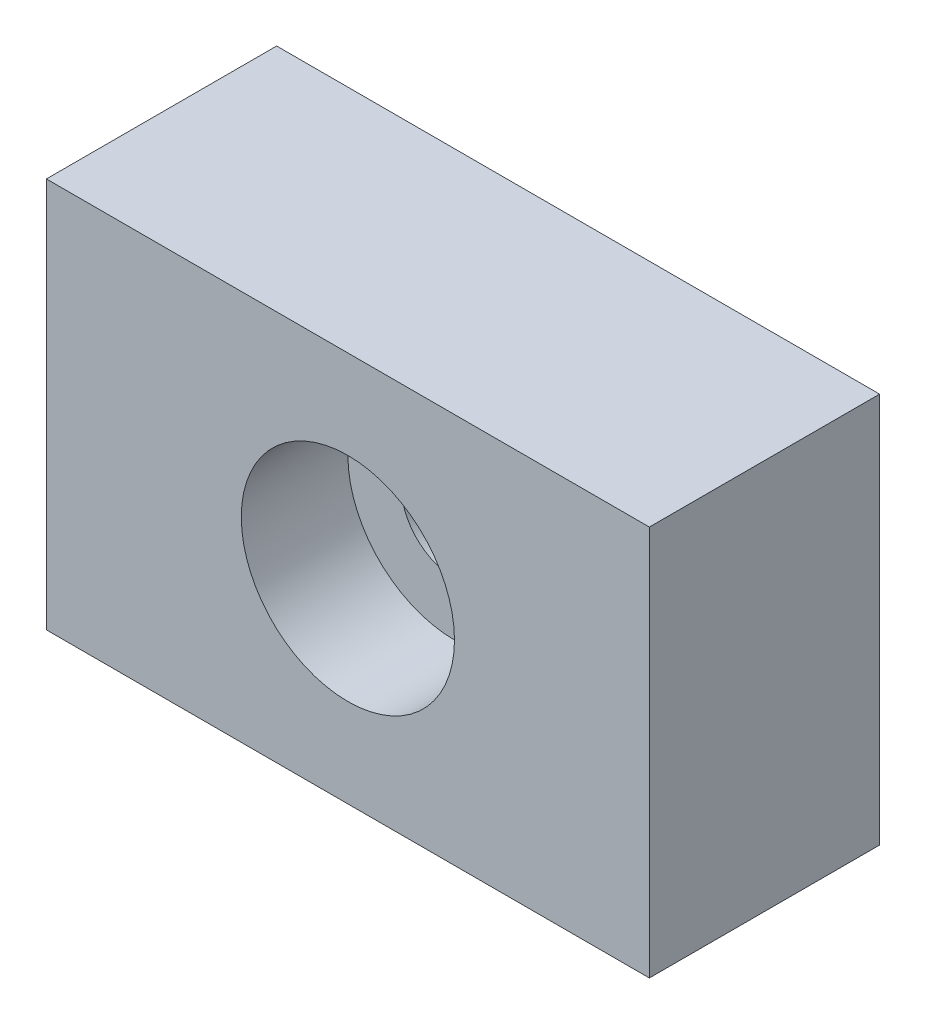
ISO-10303-21;
HEADER;
FILE_DESCRIPTION(('STEP AP214'),'2;1');
FILE_NAME('part.step','',(''),(''),'','','');
FILE_SCHEMA(('AUTOMOTIVE_DESIGN { 1 0 10303 214 1 1 1 1 }'));
ENDSEC;
DATA;
#1=APPLICATION_CONTEXT('core data for automotive mechanical design processes');
#2=APPLICATION_PROTOCOL_DEFINITION('international standard','automotive_design',2000,#1);
#3=PRODUCT_CONTEXT('',#1,'mechanical');
#4=PRODUCT('Part','Part','',(#3));
#5=PRODUCT_RELATED_PRODUCT_CATEGORY('part','',(#4));
#6=PRODUCT_DEFINITION_FORMATION('','',#4);
#7=PRODUCT_DEFINITION_CONTEXT('part definition',#1,'design');
#8=PRODUCT_DEFINITION('design','',#6,#7);
#9=PRODUCT_DEFINITION_SHAPE('','',#8);
#10=(LENGTH_UNIT() NAMED_UNIT(*) SI_UNIT(.MILLI.,.METRE.));
#11=(NAMED_UNIT(*) PLANE_ANGLE_UNIT() SI_UNIT($,.RADIAN.));
#12=(NAMED_UNIT(*) SI_UNIT($,.STERADIAN.) SOLID_ANGLE_UNIT());
#13=UNCERTAINTY_MEASURE_WITH_UNIT(LENGTH_MEASURE(1.E-05),#10,'distance_accuracy_value','');
#14=(GEOMETRIC_REPRESENTATION_CONTEXT(3) GLOBAL_UNCERTAINTY_ASSIGNED_CONTEXT((#13)) GLOBAL_UNIT_ASSIGNED_CONTEXT((#10,
#11,#12)) REPRESENTATION_CONTEXT('',''));
#15=CARTESIAN_POINT('',(0.,0.,0.));
#16=DIRECTION('',(0.,0.,1.));
#17=DIRECTION('',(1.,0.,0.));
#18=AXIS2_PLACEMENT_3D('',#15,#16,#17);
#19=CARTESIAN_POINT('',(0.,0.,5.4));
#20=DIRECTION('',(0.,0.,-1.));
#21=DIRECTION('',(-1.,0.,0.));
#22=AXIS2_PLACEMENT_3D('',#19,#20,#21);
#23=CYLINDRICAL_SURFACE('',#22,1.25);
#24=CARTESIAN_POINT('',(0.,0.,0.));
#25=DIRECTION('',(0.,0.,1.));
#26=DIRECTION('',(1.,0.,0.));
#27=AXIS2_PLACEMENT_3D('',#24,#25,#26);
#28=CIRCLE('',#27,1.25);
#29=CARTESIAN_POINT('',(-1.25,0.,0.));
#30=VERTEX_POINT('',#29);
#31=EDGE_CURVE('E102',#30,#30,#28,.T.);
#32=CARTESIAN_POINT('',(0.,0.,2.9));
#33=DIRECTION('',(0.,0.,1.));
#34=DIRECTION('',(1.,0.,0.));
#35=AXIS2_PLACEMENT_3D('',#32,#33,#34);
#36=CIRCLE('',#35,1.25);
#37=CARTESIAN_POINT('',(-1.25,0.,2.9));
#38=VERTEX_POINT('',#37);
#39=EDGE_CURVE('E37',#38,#38,#36,.T.);
#40=CARTESIAN_POINT('',(-1.25,0.,0.));
#41=CARTESIAN_POINT('',(-1.25,0.,0.0302083333333326));
#42=CARTESIAN_POINT('',(-1.25,0.,0.0604166666666661));
#43=CARTESIAN_POINT('',(-1.25,0.,0.120833333333333));
#44=CARTESIAN_POINT('',(-1.25,0.,0.151041666666666));
#45=CARTESIAN_POINT('',(-1.25,0.,0.211458333333333));
#46=CARTESIAN_POINT('',(-1.25,0.,0.241666666666666));
#47=CARTESIAN_POINT('',(-1.25,0.,0.302083333333333));
#48=CARTESIAN_POINT('',(-1.25,0.,0.332291666666666));
#49=CARTESIAN_POINT('',(-1.25,0.,0.392708333333333));
#50=CARTESIAN_POINT('',(-1.25,0.,0.422916666666666));
#51=CARTESIAN_POINT('',(-1.25,0.,0.483333333333333));
#52=CARTESIAN_POINT('',(-1.25,0.,0.513541666666666));
#53=CARTESIAN_POINT('',(-1.25,0.,0.573958333333333));
#54=CARTESIAN_POINT('',(-1.25,0.,0.604166666666666));
#55=CARTESIAN_POINT('',(-1.25,0.,0.664583333333333));
#56=CARTESIAN_POINT('',(-1.25,0.,0.694791666666666));
#57=CARTESIAN_POINT('',(-1.25,0.,0.755208333333333));
#58=CARTESIAN_POINT('',(-1.25,0.,0.785416666666666));
#59=CARTESIAN_POINT('',(-1.25,0.,0.845833333333333));
#60=CARTESIAN_POINT('',(-1.25,0.,0.876041666666666));
#61=CARTESIAN_POINT('',(-1.25,0.,0.936458333333333));
#62=CARTESIAN_POINT('',(-1.25,0.,0.966666666666666));
#63=CARTESIAN_POINT('',(-1.25,0.,1.02708333333333));
#64=CARTESIAN_POINT('',(-1.25,0.,1.05729166666667));
#65=CARTESIAN_POINT('',(-1.25,0.,1.11770833333333));
#66=CARTESIAN_POINT('',(-1.25,0.,1.14791666666667));
#67=CARTESIAN_POINT('',(-1.25,0.,1.20833333333333));
#68=CARTESIAN_POINT('',(-1.25,0.,1.23854166666667));
#69=CARTESIAN_POINT('',(-1.25,0.,1.29895833333333));
#70=CARTESIAN_POINT('',(-1.25,0.,1.32916666666667));
#71=CARTESIAN_POINT('',(-1.25,0.,1.38958333333333));
#72=CARTESIAN_POINT('',(-1.25,0.,1.41979166666667));
#73=CARTESIAN_POINT('',(-1.25,0.,1.48020833333333));
#74=CARTESIAN_POINT('',(-1.25,0.,1.51041666666667));
#75=CARTESIAN_POINT('',(-1.25,0.,1.57083333333333));
#76=CARTESIAN_POINT('',(-1.25,0.,1.60104166666667));
#77=CARTESIAN_POINT('',(-1.25,0.,1.66145833333333));
#78=CARTESIAN_POINT('',(-1.25,0.,1.69166666666667));
#79=CARTESIAN_POINT('',(-1.25,0.,1.75208333333333));
#80=CARTESIAN_POINT('',(-1.25,0.,1.78229166666667));
#81=CARTESIAN_POINT('',(-1.25,0.,1.84270833333333));
#82=CARTESIAN_POINT('',(-1.25,0.,1.87291666666667));
#83=CARTESIAN_POINT('',(-1.25,0.,1.93333333333333));
#84=CARTESIAN_POINT('',(-1.25,0.,1.96354166666667));
#85=CARTESIAN_POINT('',(-1.25,0.,2.02395833333333));
#86=CARTESIAN_POINT('',(-1.25,0.,2.05416666666667));
#87=CARTESIAN_POINT('',(-1.25,0.,2.11458333333333));
#88=CARTESIAN_POINT('',(-1.25,0.,2.14479166666667));
#89=CARTESIAN_POINT('',(-1.25,0.,2.20520833333333));
#90=CARTESIAN_POINT('',(-1.25,0.,2.23541666666667));
#91=CARTESIAN_POINT('',(-1.25,0.,2.29583333333333));
#92=CARTESIAN_POINT('',(-1.25,0.,2.32604166666667));
#93=CARTESIAN_POINT('',(-1.25,0.,2.38645833333333));
#94=CARTESIAN_POINT('',(-1.25,0.,2.41666666666667));
#95=CARTESIAN_POINT('',(-1.25,0.,2.47708333333333));
#96=CARTESIAN_POINT('',(-1.25,0.,2.50729166666667));
#97=CARTESIAN_POINT('',(-1.25,0.,2.56770833333333));
#98=CARTESIAN_POINT('',(-1.25,0.,2.59791666666667));
#99=CARTESIAN_POINT('',(-1.25,0.,2.65833333333333));
#100=CARTESIAN_POINT('',(-1.25,0.,2.68854166666667));
#101=CARTESIAN_POINT('',(-1.25,0.,2.74895833333333));
#102=CARTESIAN_POINT('',(-1.25,0.,2.77916666666667));
#103=CARTESIAN_POINT('',(-1.25,0.,2.83958333333333));
#104=CARTESIAN_POINT('',(-1.25,0.,2.86979166666667));
#105=CARTESIAN_POINT('',(-1.25,0.,2.9));
#106=B_SPLINE_CURVE_WITH_KNOTS('',3,(#40,#41,#42,#43,#44,#45,#46,#47,#48,#49,#50,#51,#52,#53,
#54,#55,#56,#57,#58,#59,#60,#61,#62,#63,#64,#65,#66,#67,#68,#69,#70,#71,#72,#73,#74,#75,#76,#77,
#78,#79,#80,#81,#82,#83,#84,#85,#86,#87,#88,#89,#90,#91,#92,#93,#94,#95,#96,#97,#98,#99,#100,
#101,#102,#103,#104,#105),.UNSPECIFIED.,.F.,.F.,(4,2,2,2,2,2,2,2,2,2,2,2,2,2,2,2,2,2,2,2,2,2,2,
2,2,2,2,2,2,2,2,2,4),(0.,0.0906250000000004,0.18125,0.271875,0.3625,0.453125,0.54375,0.634375,
0.725,0.815625,0.906250000000001,0.996875,1.0875,1.178125,1.26875,1.359375,1.45,1.540625,
1.63125,1.721875,1.8125,1.903125,1.99375,2.084375,2.175,2.265625,2.35625,2.446875,2.5375,
2.628125,2.71875,2.809375,2.9),.UNSPECIFIED.);
#107=EDGE_CURVE('BSEAM33',#30,#38,#106,.T.);
#108=ORIENTED_EDGE('',*,*,#31,.F.);
#109=ORIENTED_EDGE('',*,*,#39,.T.);
#110=ORIENTED_EDGE('',*,*,#107,.T.);
#111=ORIENTED_EDGE('',*,*,#107,.F.);
#112=EDGE_LOOP('',(#108,#110,#109,#111));
#113=FACE_BOUND('',#112,.T.);
#114=ADVANCED_FACE('F33',(#113),#23,.F.);
#115=CARTESIAN_POINT('',(0.,0.,5.4));
#116=DIRECTION('',(0.,0.,1.));
#117=DIRECTION('',(1.,0.,0.));
#118=AXIS2_PLACEMENT_3D('',#115,#116,#117);
#119=PLANE('',#118);
#120=CARTESIAN_POINT('',(0.,0.,5.4));
#121=DIRECTION('',(0.,0.,1.));
#122=DIRECTION('',(1.,0.,0.));
#123=AXIS2_PLACEMENT_3D('',#120,#121,#122);
#124=CIRCLE('',#123,2.5);
#125=CARTESIAN_POINT('',(2.5,0.,5.4));
#126=VERTEX_POINT('',#125);
#127=EDGE_CURVE('E116',#126,#126,#124,.T.);
#128=ORIENTED_EDGE('',*,*,#127,.F.);
#129=EDGE_LOOP('',(#128));
#130=FACE_BOUND('',#129,.T.);
#131=DIRECTION('',(0.,1.,0.));
#132=VECTOR('',#131,1.);
#133=CARTESIAN_POINT('',(7.07107160710829,4.58012592733151,5.4));
#134=LINE('',#133,#132);
#135=CARTESIAN_POINT('',(7.07107160710829,-4.58012592733151,5.4));
#136=VERTEX_POINT('',#135);
#137=CARTESIAN_POINT('',(7.07107160710829,4.58012592733151,5.4));
#138=VERTEX_POINT('',#137);
#139=EDGE_CURVE('E86',#136,#138,#134,.T.);
#140=ORIENTED_EDGE('',*,*,#139,.T.);
#141=DIRECTION('',(-1.,0.,0.));
#142=VECTOR('',#141,1.);
#143=CARTESIAN_POINT('',(-7.07107160710829,4.58012592733151,5.4));
#144=LINE('',#143,#142);
#145=CARTESIAN_POINT('',(-7.07107160710829,4.58012592733151,5.4));
#146=VERTEX_POINT('',#145);
#147=EDGE_CURVE('E81',#138,#146,#144,.T.);
#148=ORIENTED_EDGE('',*,*,#147,.T.);
#149=DIRECTION('',(0.,-1.,0.));
#150=VECTOR('',#149,1.);
#151=CARTESIAN_POINT('',(-7.07107160710829,4.58012592733151,5.4));
#152=LINE('',#151,#150);
#153=CARTESIAN_POINT('',(-7.07107160710829,-4.58012592733151,5.4));
#154=VERTEX_POINT('',#153);
#155=EDGE_CURVE('E84',#146,#154,#152,.T.);
#156=ORIENTED_EDGE('',*,*,#155,.T.);
#157=DIRECTION('',(1.,0.,0.));
#158=VECTOR('',#157,1.);
#159=CARTESIAN_POINT('',(-7.07107160710829,-4.58012592733151,5.4));
#160=LINE('',#159,#158);
#161=EDGE_CURVE('E51',#154,#136,#160,.T.);
#162=ORIENTED_EDGE('',*,*,#161,.T.);
#163=EDGE_LOOP('',(#140,#148,#156,#162));
#164=FACE_BOUND('',#163,.T.);
#165=ADVANCED_FACE('F82',(#130,#164),#119,.T.);
#166=CARTESIAN_POINT('',(0.,0.,0.));
#167=DIRECTION('',(0.,0.,1.));
#168=DIRECTION('',(1.,0.,0.));
#169=AXIS2_PLACEMENT_3D('',#166,#167,#168);
#170=PLANE('',#169);
#171=DIRECTION('',(0.,1.,0.));
#172=VECTOR('',#171,1.);
#173=CARTESIAN_POINT('',(7.07107160710829,4.58012592733151,0.));
#174=LINE('',#173,#172);
#175=CARTESIAN_POINT('',(7.07107160710829,-4.58012592733151,0.));
#176=VERTEX_POINT('',#175);
#177=CARTESIAN_POINT('',(7.07107160710829,4.58012592733151,0.));
#178=VERTEX_POINT('',#177);
#179=EDGE_CURVE('E99',#176,#178,#174,.T.);
#180=ORIENTED_EDGE('',*,*,#179,.F.);
#181=DIRECTION('',(1.,0.,0.));
#182=VECTOR('',#181,1.);
#183=CARTESIAN_POINT('',(-7.07107160710829,-4.58012592733151,0.));
#184=LINE('',#183,#182);
#185=CARTESIAN_POINT('',(-7.07107160710829,-4.58012592733151,0.));
#186=VERTEX_POINT('',#185);
#187=EDGE_CURVE('E74',#186,#176,#184,.T.);
#188=ORIENTED_EDGE('',*,*,#187,.F.);
#189=DIRECTION('',(0.,-1.,0.));
#190=VECTOR('',#189,1.);
#191=CARTESIAN_POINT('',(-7.07107160710829,4.58012592733151,0.));
#192=LINE('',#191,#190);
#193=CARTESIAN_POINT('',(-7.07107160710829,4.58012592733151,0.));
#194=VERTEX_POINT('',#193);
#195=EDGE_CURVE('E68',#194,#186,#192,.T.);
#196=ORIENTED_EDGE('',*,*,#195,.F.);
#197=DIRECTION('',(-1.,0.,0.));
#198=VECTOR('',#197,1.);
#199=CARTESIAN_POINT('',(-7.07107160710829,4.58012592733151,0.));
#200=LINE('',#199,#198);
#201=EDGE_CURVE('E90',#178,#194,#200,.T.);
#202=ORIENTED_EDGE('',*,*,#201,.F.);
#203=EDGE_LOOP('',(#180,#188,#196,#202));
#204=FACE_BOUND('',#203,.T.);
#205=ORIENTED_EDGE('',*,*,#31,.T.);
#206=EDGE_LOOP('',(#205));
#207=FACE_BOUND('',#206,.T.);
#208=ADVANCED_FACE('F110',(#204,#207),#170,.F.);
#209=CARTESIAN_POINT('',(7.07107160710829,4.58012592733151,5.4));
#210=DIRECTION('',(-1.,0.,0.));
#211=DIRECTION('',(0.,0.,1.));
#212=AXIS2_PLACEMENT_3D('',#209,#210,#211);
#213=PLANE('',#212);
#214=ORIENTED_EDGE('',*,*,#179,.T.);
#215=DIRECTION('',(0.,0.,-1.));
#216=VECTOR('',#215,1.);
#217=CARTESIAN_POINT('',(7.07107160710829,4.58012592733151,5.4));
#218=LINE('',#217,#216);
#219=EDGE_CURVE('E11',#138,#178,#218,.T.);
#220=ORIENTED_EDGE('',*,*,#219,.F.);
#221=ORIENTED_EDGE('',*,*,#139,.F.);
#222=DIRECTION('',(0.,0.,-1.));
#223=VECTOR('',#222,1.);
#224=CARTESIAN_POINT('',(7.07107160710829,-4.58012592733151,5.4));
#225=LINE('',#224,#223);
#226=EDGE_CURVE('E95',#136,#176,#225,.T.);
#227=ORIENTED_EDGE('',*,*,#226,.T.);
#228=EDGE_LOOP('',(#214,#220,#221,#227));
#229=FACE_BOUND('',#228,.T.);
#230=ADVANCED_FACE('F35',(#229),#213,.F.);
#231=CARTESIAN_POINT('',(-7.07107160710829,4.58012592733151,5.4));
#232=DIRECTION('',(0.,-1.,0.));
#233=DIRECTION('',(0.,0.,-1.));
#234=AXIS2_PLACEMENT_3D('',#231,#232,#233);
#235=PLANE('',#234);
#236=ORIENTED_EDGE('',*,*,#201,.T.);
#237=DIRECTION('',(0.,0.,-1.));
#238=VECTOR('',#237,1.);
#239=CARTESIAN_POINT('',(-7.07107160710829,4.58012592733151,5.4));
#240=LINE('',#239,#238);
#241=EDGE_CURVE('E43',#146,#194,#240,.T.);
#242=ORIENTED_EDGE('',*,*,#241,.F.);
#243=ORIENTED_EDGE('',*,*,#147,.F.);
#244=ORIENTED_EDGE('',*,*,#219,.T.);
#245=EDGE_LOOP('',(#236,#242,#243,#244));
#246=FACE_BOUND('',#245,.T.);
#247=ADVANCED_FACE('F89',(#246),#235,.F.);
#248=CARTESIAN_POINT('',(-7.07107160710829,4.58012592733151,5.4));
#249=DIRECTION('',(1.,0.,0.));
#250=DIRECTION('',(0.,0.,-1.));
#251=AXIS2_PLACEMENT_3D('',#248,#249,#250);
#252=PLANE('',#251);
#253=ORIENTED_EDGE('',*,*,#195,.T.);
#254=DIRECTION('',(0.,0.,-1.));
#255=VECTOR('',#254,1.);
#256=CARTESIAN_POINT('',(-7.07107160710829,-4.58012592733151,5.4));
#257=LINE('',#256,#255);
#258=EDGE_CURVE('E91',#154,#186,#257,.T.);
#259=ORIENTED_EDGE('',*,*,#258,.F.);
#260=ORIENTED_EDGE('',*,*,#155,.F.);
#261=ORIENTED_EDGE('',*,*,#241,.T.);
#262=EDGE_LOOP('',(#253,#259,#260,#261));
#263=FACE_BOUND('',#262,.T.);
#264=ADVANCED_FACE('F93',(#263),#252,.F.);
#265=CARTESIAN_POINT('',(-7.07107160710829,-4.58012592733151,5.4));
#266=DIRECTION('',(0.,1.,0.));
#267=DIRECTION('',(0.,0.,1.));
#268=AXIS2_PLACEMENT_3D('',#265,#266,#267);
#269=PLANE('',#268);
#270=ORIENTED_EDGE('',*,*,#187,.T.);
#271=ORIENTED_EDGE('',*,*,#226,.F.);
#272=ORIENTED_EDGE('',*,*,#161,.F.);
#273=ORIENTED_EDGE('',*,*,#258,.T.);
#274=EDGE_LOOP('',(#270,#271,#272,#273));
#275=FACE_BOUND('',#274,.T.);
#276=ADVANCED_FACE('F107',(#275),#269,.F.);
#277=CARTESIAN_POINT('',(0.,0.,2.9));
#278=DIRECTION('',(0.,0.,1.));
#279=DIRECTION('',(1.,0.,0.));
#280=AXIS2_PLACEMENT_3D('',#277,#278,#279);
#281=CYLINDRICAL_SURFACE('',#280,2.5);
#282=CARTESIAN_POINT('',(0.,0.,2.9));
#283=DIRECTION('',(0.,0.,1.));
#284=DIRECTION('',(1.,0.,0.));
#285=AXIS2_PLACEMENT_3D('',#282,#283,#284);
#286=CIRCLE('',#285,2.5);
#287=CARTESIAN_POINT('',(2.5,0.,2.9));
#288=VERTEX_POINT('',#287);
#289=EDGE_CURVE('E119',#288,#288,#286,.T.);
#290=ORIENTED_EDGE('',*,*,#289,.F.);
#291=EDGE_LOOP('',(#290));
#292=FACE_BOUND('',#291,.T.);
#293=ORIENTED_EDGE('',*,*,#127,.T.);
#294=EDGE_LOOP('',(#293));
#295=FACE_BOUND('',#294,.T.);
#296=ADVANCED_FACE('F129',(#292,#295),#281,.F.);
#297=CARTESIAN_POINT('',(0.,0.,2.9));
#298=DIRECTION('',(0.,0.,1.));
#299=DIRECTION('',(1.,0.,0.));
#300=AXIS2_PLACEMENT_3D('',#297,#298,#299);
#301=PLANE('',#300);
#302=ORIENTED_EDGE('',*,*,#39,.F.);
#303=EDGE_LOOP('',(#302));
#304=FACE_BOUND('',#303,.T.);
#305=ORIENTED_EDGE('',*,*,#289,.T.);
#306=EDGE_LOOP('',(#305));
#307=FACE_BOUND('',#306,.T.);
#308=ADVANCED_FACE('F127',(#304,#307),#301,.T.);
#309=CLOSED_SHELL('',(#114,#165,#208,#230,#247,#264,#276,#296,#308));
#310=MANIFOLD_SOLID_BREP('B2',#309);
#311=ADVANCED_BREP_SHAPE_REPRESENTATION('',(#18,#310),#14);
#312=SHAPE_DEFINITION_REPRESENTATION(#9,#311);
ENDSEC;
END-ISO-10303-21;
